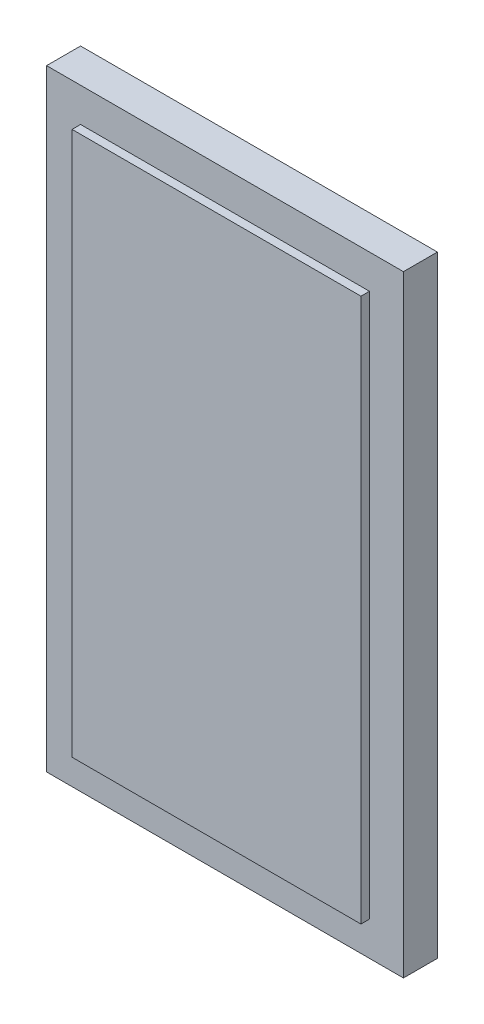
ISO-10303-21;
HEADER;
FILE_DESCRIPTION(('STEP AP214'),'2;1');
FILE_NAME('part.step','',(''),(''),'','','');
FILE_SCHEMA(('AUTOMOTIVE_DESIGN { 1 0 10303 214 1 1 1 1 }'));
ENDSEC;
DATA;
#1=APPLICATION_CONTEXT('core data for automotive mechanical design processes');
#2=APPLICATION_PROTOCOL_DEFINITION('international standard','automotive_design',2000,#1);
#3=PRODUCT_CONTEXT('',#1,'mechanical');
#4=PRODUCT('Part','Part','',(#3));
#5=PRODUCT_RELATED_PRODUCT_CATEGORY('part','',(#4));
#6=PRODUCT_DEFINITION_FORMATION('','',#4);
#7=PRODUCT_DEFINITION_CONTEXT('part definition',#1,'design');
#8=PRODUCT_DEFINITION('design','',#6,#7);
#9=PRODUCT_DEFINITION_SHAPE('','',#8);
#10=(LENGTH_UNIT() NAMED_UNIT(*) SI_UNIT(.MILLI.,.METRE.));
#11=(NAMED_UNIT(*) PLANE_ANGLE_UNIT() SI_UNIT($,.RADIAN.));
#12=(NAMED_UNIT(*) SI_UNIT($,.STERADIAN.) SOLID_ANGLE_UNIT());
#13=UNCERTAINTY_MEASURE_WITH_UNIT(LENGTH_MEASURE(1.E-05),#10,'distance_accuracy_value','');
#14=(GEOMETRIC_REPRESENTATION_CONTEXT(3) GLOBAL_UNCERTAINTY_ASSIGNED_CONTEXT((#13)) GLOBAL_UNIT_ASSIGNED_CONTEXT((#10,
#11,#12)) REPRESENTATION_CONTEXT('',''));
#15=CARTESIAN_POINT('',(0.,0.,0.));
#16=DIRECTION('',(0.,0.,1.));
#17=DIRECTION('',(1.,0.,0.));
#18=AXIS2_PLACEMENT_3D('',#15,#16,#17);
#19=CARTESIAN_POINT('',(0.,0.,10.));
#20=DIRECTION('',(0.,0.,-1.));
#21=DIRECTION('',(-1.,0.,0.));
#22=AXIS2_PLACEMENT_3D('',#19,#20,#21);
#23=PLANE('',#22);
#24=DIRECTION('',(0.,-1.,0.));
#25=VECTOR('',#24,1.);
#26=CARTESIAN_POINT('',(0.,0.,10.));
#27=LINE('',#26,#25);
#28=CARTESIAN_POINT('',(0.,180.,10.));
#29=VERTEX_POINT('',#28);
#30=CARTESIAN_POINT('',(0.,0.,10.));
#31=VERTEX_POINT('',#30);
#32=EDGE_CURVE('E133',#29,#31,#27,.T.);
#33=ORIENTED_EDGE('',*,*,#32,.T.);
#34=DIRECTION('',(1.,0.,0.));
#35=VECTOR('',#34,1.);
#36=CARTESIAN_POINT('',(0.,0.,10.));
#37=LINE('',#36,#35);
#38=CARTESIAN_POINT('',(105.,0.,10.));
#39=VERTEX_POINT('',#38);
#40=EDGE_CURVE('E136',#31,#39,#37,.T.);
#41=ORIENTED_EDGE('',*,*,#40,.T.);
#42=DIRECTION('',(0.,1.,0.));
#43=VECTOR('',#42,1.);
#44=CARTESIAN_POINT('',(105.,0.,10.));
#45=LINE('',#44,#43);
#46=CARTESIAN_POINT('',(105.,180.,10.));
#47=VERTEX_POINT('',#46);
#48=EDGE_CURVE('E139',#39,#47,#45,.T.);
#49=ORIENTED_EDGE('',*,*,#48,.T.);
#50=DIRECTION('',(-1.,0.,0.));
#51=VECTOR('',#50,1.);
#52=CARTESIAN_POINT('',(0.,180.,10.));
#53=LINE('',#52,#51);
#54=EDGE_CURVE('E141',#47,#29,#53,.T.);
#55=ORIENTED_EDGE('',*,*,#54,.T.);
#56=EDGE_LOOP('',(#33,#41,#49,#55));
#57=FACE_BOUND('',#56,.T.);
#58=DIRECTION('',(-1.,0.,0.));
#59=VECTOR('',#58,1.);
#60=CARTESIAN_POINT('',(95.,170.,10.));
#61=LINE('',#60,#59);
#62=CARTESIAN_POINT('',(95.,170.,10.));
#63=VERTEX_POINT('',#62);
#64=CARTESIAN_POINT('',(10.,170.,10.));
#65=VERTEX_POINT('',#64);
#66=EDGE_CURVE('E54',#63,#65,#61,.T.);
#67=ORIENTED_EDGE('',*,*,#66,.F.);
#68=DIRECTION('',(0.,1.,0.));
#69=VECTOR('',#68,1.);
#70=CARTESIAN_POINT('',(95.,10.,10.));
#71=LINE('',#70,#69);
#72=CARTESIAN_POINT('',(95.,10.,10.));
#73=VERTEX_POINT('',#72);
#74=EDGE_CURVE('E58',#73,#63,#71,.T.);
#75=ORIENTED_EDGE('',*,*,#74,.F.);
#76=DIRECTION('',(1.,0.,0.));
#77=VECTOR('',#76,1.);
#78=CARTESIAN_POINT('',(10.,10.,10.));
#79=LINE('',#78,#77);
#80=CARTESIAN_POINT('',(10.,10.,10.));
#81=VERTEX_POINT('',#80);
#82=EDGE_CURVE('E251',#81,#73,#79,.T.);
#83=ORIENTED_EDGE('',*,*,#82,.F.);
#84=DIRECTION('',(0.,-1.,0.));
#85=VECTOR('',#84,1.);
#86=CARTESIAN_POINT('',(10.,170.,10.));
#87=LINE('',#86,#85);
#88=EDGE_CURVE('E257',#65,#81,#87,.T.);
#89=ORIENTED_EDGE('',*,*,#88,.F.);
#90=EDGE_LOOP('',(#67,#75,#83,#89));
#91=FACE_BOUND('',#90,.T.);
#92=ADVANCED_FACE('F39',(#57,#91),#23,.F.);
#93=CARTESIAN_POINT('',(0.,0.,10.));
#94=DIRECTION('',(1.,0.,0.));
#95=DIRECTION('',(0.,0.,-1.));
#96=AXIS2_PLACEMENT_3D('',#93,#94,#95);
#97=PLANE('',#96);
#98=DIRECTION('',(0.,-1.,0.));
#99=VECTOR('',#98,1.);
#100=CARTESIAN_POINT('',(0.,0.,0.));
#101=LINE('',#100,#99);
#102=CARTESIAN_POINT('',(0.,180.,0.));
#103=VERTEX_POINT('',#102);
#104=CARTESIAN_POINT('',(0.,0.,0.));
#105=VERTEX_POINT('',#104);
#106=EDGE_CURVE('E124',#103,#105,#101,.T.);
#107=ORIENTED_EDGE('',*,*,#106,.T.);
#108=DIRECTION('',(0.,0.,-1.));
#109=VECTOR('',#108,1.);
#110=CARTESIAN_POINT('',(0.,0.,10.));
#111=LINE('',#110,#109);
#112=EDGE_CURVE('E11',#31,#105,#111,.T.);
#113=ORIENTED_EDGE('',*,*,#112,.F.);
#114=ORIENTED_EDGE('',*,*,#32,.F.);
#115=DIRECTION('',(0.,0.,-1.));
#116=VECTOR('',#115,1.);
#117=CARTESIAN_POINT('',(0.,180.,10.));
#118=LINE('',#117,#116);
#119=EDGE_CURVE('E142',#29,#103,#118,.T.);
#120=ORIENTED_EDGE('',*,*,#119,.T.);
#121=EDGE_LOOP('',(#107,#113,#114,#120));
#122=FACE_BOUND('',#121,.T.);
#123=ADVANCED_FACE('F41',(#122),#97,.F.);
#124=CARTESIAN_POINT('',(0.,0.,10.));
#125=DIRECTION('',(0.,1.,0.));
#126=DIRECTION('',(0.,0.,1.));
#127=AXIS2_PLACEMENT_3D('',#124,#125,#126);
#128=PLANE('',#127);
#129=DIRECTION('',(1.,0.,0.));
#130=VECTOR('',#129,1.);
#131=CARTESIAN_POINT('',(0.,0.,0.));
#132=LINE('',#131,#130);
#133=CARTESIAN_POINT('',(105.,0.,0.));
#134=VERTEX_POINT('',#133);
#135=EDGE_CURVE('E127',#105,#134,#132,.T.);
#136=ORIENTED_EDGE('',*,*,#135,.T.);
#137=DIRECTION('',(0.,0.,-1.));
#138=VECTOR('',#137,1.);
#139=CARTESIAN_POINT('',(105.,0.,10.));
#140=LINE('',#139,#138);
#141=EDGE_CURVE('E47',#39,#134,#140,.T.);
#142=ORIENTED_EDGE('',*,*,#141,.F.);
#143=ORIENTED_EDGE('',*,*,#40,.F.);
#144=ORIENTED_EDGE('',*,*,#112,.T.);
#145=EDGE_LOOP('',(#136,#142,#143,#144));
#146=FACE_BOUND('',#145,.T.);
#147=ADVANCED_FACE('F172',(#146),#128,.F.);
#148=CARTESIAN_POINT('',(105.,0.,10.));
#149=DIRECTION('',(-1.,0.,0.));
#150=DIRECTION('',(0.,0.,1.));
#151=AXIS2_PLACEMENT_3D('',#148,#149,#150);
#152=PLANE('',#151);
#153=DIRECTION('',(0.,1.,0.));
#154=VECTOR('',#153,1.);
#155=CARTESIAN_POINT('',(105.,0.,0.));
#156=LINE('',#155,#154);
#157=CARTESIAN_POINT('',(105.,180.,0.));
#158=VERTEX_POINT('',#157);
#159=EDGE_CURVE('E145',#134,#158,#156,.T.);
#160=ORIENTED_EDGE('',*,*,#159,.T.);
#161=DIRECTION('',(0.,0.,-1.));
#162=VECTOR('',#161,1.);
#163=CARTESIAN_POINT('',(105.,180.,10.));
#164=LINE('',#163,#162);
#165=EDGE_CURVE('E150',#47,#158,#164,.T.);
#166=ORIENTED_EDGE('',*,*,#165,.F.);
#167=ORIENTED_EDGE('',*,*,#48,.F.);
#168=ORIENTED_EDGE('',*,*,#141,.T.);
#169=EDGE_LOOP('',(#160,#166,#167,#168));
#170=FACE_BOUND('',#169,.T.);
#171=ADVANCED_FACE('F157',(#170),#152,.F.);
#172=CARTESIAN_POINT('',(0.,180.,10.));
#173=DIRECTION('',(0.,-1.,0.));
#174=DIRECTION('',(0.,0.,-1.));
#175=AXIS2_PLACEMENT_3D('',#172,#173,#174);
#176=PLANE('',#175);
#177=DIRECTION('',(-1.,0.,0.));
#178=VECTOR('',#177,1.);
#179=CARTESIAN_POINT('',(0.,180.,0.));
#180=LINE('',#179,#178);
#181=EDGE_CURVE('E137',#158,#103,#180,.T.);
#182=ORIENTED_EDGE('',*,*,#181,.T.);
#183=ORIENTED_EDGE('',*,*,#119,.F.);
#184=ORIENTED_EDGE('',*,*,#54,.F.);
#185=ORIENTED_EDGE('',*,*,#165,.T.);
#186=EDGE_LOOP('',(#182,#183,#184,#185));
#187=FACE_BOUND('',#186,.T.);
#188=ADVANCED_FACE('F166',(#187),#176,.F.);
#189=CARTESIAN_POINT('',(0.,0.,0.));
#190=DIRECTION('',(0.,0.,-1.));
#191=DIRECTION('',(-1.,0.,0.));
#192=AXIS2_PLACEMENT_3D('',#189,#190,#191);
#193=PLANE('',#192);
#194=ORIENTED_EDGE('',*,*,#106,.F.);
#195=ORIENTED_EDGE('',*,*,#181,.F.);
#196=ORIENTED_EDGE('',*,*,#159,.F.);
#197=ORIENTED_EDGE('',*,*,#135,.F.);
#198=EDGE_LOOP('',(#194,#195,#196,#197));
#199=FACE_BOUND('',#198,.T.);
#200=ADVANCED_FACE('F163',(#199),#193,.T.);
#201=CARTESIAN_POINT('',(95.,170.,12.5));
#202=DIRECTION('',(0.,-1.,0.));
#203=DIRECTION('',(0.,0.,-1.));
#204=AXIS2_PLACEMENT_3D('',#201,#202,#203);
#205=PLANE('',#204);
#206=ORIENTED_EDGE('',*,*,#66,.T.);
#207=DIRECTION('',(0.,0.,-1.));
#208=VECTOR('',#207,1.);
#209=CARTESIAN_POINT('',(10.,170.,12.5));
#210=LINE('',#209,#208);
#211=CARTESIAN_POINT('',(10.,170.,12.5));
#212=VERTEX_POINT('',#211);
#213=EDGE_CURVE('E107',#212,#65,#210,.T.);
#214=ORIENTED_EDGE('',*,*,#213,.F.);
#215=DIRECTION('',(-1.,0.,0.));
#216=VECTOR('',#215,1.);
#217=CARTESIAN_POINT('',(95.,170.,12.5));
#218=LINE('',#217,#216);
#219=CARTESIAN_POINT('',(95.,170.,12.5));
#220=VERTEX_POINT('',#219);
#221=EDGE_CURVE('E113',#220,#212,#218,.T.);
#222=ORIENTED_EDGE('',*,*,#221,.F.);
#223=DIRECTION('',(0.,0.,-1.));
#224=VECTOR('',#223,1.);
#225=CARTESIAN_POINT('',(95.,170.,12.5));
#226=LINE('',#225,#224);
#227=EDGE_CURVE('E249',#220,#63,#226,.T.);
#228=ORIENTED_EDGE('',*,*,#227,.T.);
#229=EDGE_LOOP('',(#206,#214,#222,#228));
#230=FACE_BOUND('',#229,.T.);
#231=ADVANCED_FACE('F123',(#230),#205,.F.);
#232=CARTESIAN_POINT('',(10.,170.,12.5));
#233=DIRECTION('',(1.,0.,0.));
#234=DIRECTION('',(0.,0.,-1.));
#235=AXIS2_PLACEMENT_3D('',#232,#233,#234);
#236=PLANE('',#235);
#237=ORIENTED_EDGE('',*,*,#88,.T.);
#238=DIRECTION('',(0.,0.,-1.));
#239=VECTOR('',#238,1.);
#240=CARTESIAN_POINT('',(10.,10.,12.5));
#241=LINE('',#240,#239);
#242=CARTESIAN_POINT('',(10.,10.,12.5));
#243=VERTEX_POINT('',#242);
#244=EDGE_CURVE('E109',#243,#81,#241,.T.);
#245=ORIENTED_EDGE('',*,*,#244,.F.);
#246=DIRECTION('',(0.,-1.,0.));
#247=VECTOR('',#246,1.);
#248=CARTESIAN_POINT('',(10.,170.,12.5));
#249=LINE('',#248,#247);
#250=EDGE_CURVE('E102',#212,#243,#249,.T.);
#251=ORIENTED_EDGE('',*,*,#250,.F.);
#252=ORIENTED_EDGE('',*,*,#213,.T.);
#253=EDGE_LOOP('',(#237,#245,#251,#252));
#254=FACE_BOUND('',#253,.T.);
#255=ADVANCED_FACE('F105',(#254),#236,.F.);
#256=CARTESIAN_POINT('',(10.,10.,12.5));
#257=DIRECTION('',(0.,1.,0.));
#258=DIRECTION('',(0.,0.,1.));
#259=AXIS2_PLACEMENT_3D('',#256,#257,#258);
#260=PLANE('',#259);
#261=ORIENTED_EDGE('',*,*,#82,.T.);
#262=DIRECTION('',(0.,0.,-1.));
#263=VECTOR('',#262,1.);
#264=CARTESIAN_POINT('',(95.,10.,12.5));
#265=LINE('',#264,#263);
#266=CARTESIAN_POINT('',(95.,10.,12.5));
#267=VERTEX_POINT('',#266);
#268=EDGE_CURVE('E129',#267,#73,#265,.T.);
#269=ORIENTED_EDGE('',*,*,#268,.F.);
#270=DIRECTION('',(1.,0.,0.));
#271=VECTOR('',#270,1.);
#272=CARTESIAN_POINT('',(10.,10.,12.5));
#273=LINE('',#272,#271);
#274=EDGE_CURVE('E112',#243,#267,#273,.T.);
#275=ORIENTED_EDGE('',*,*,#274,.F.);
#276=ORIENTED_EDGE('',*,*,#244,.T.);
#277=EDGE_LOOP('',(#261,#269,#275,#276));
#278=FACE_BOUND('',#277,.T.);
#279=ADVANCED_FACE('F219',(#278),#260,.F.);
#280=CARTESIAN_POINT('',(95.,10.,12.5));
#281=DIRECTION('',(-1.,0.,0.));
#282=DIRECTION('',(0.,0.,1.));
#283=AXIS2_PLACEMENT_3D('',#280,#281,#282);
#284=PLANE('',#283);
#285=ORIENTED_EDGE('',*,*,#74,.T.);
#286=ORIENTED_EDGE('',*,*,#227,.F.);
#287=DIRECTION('',(0.,1.,0.));
#288=VECTOR('',#287,1.);
#289=CARTESIAN_POINT('',(95.,10.,12.5));
#290=LINE('',#289,#288);
#291=EDGE_CURVE('E118',#267,#220,#290,.T.);
#292=ORIENTED_EDGE('',*,*,#291,.F.);
#293=ORIENTED_EDGE('',*,*,#268,.T.);
#294=EDGE_LOOP('',(#285,#286,#292,#293));
#295=FACE_BOUND('',#294,.T.);
#296=ADVANCED_FACE('F227',(#295),#284,.F.);
#297=CARTESIAN_POINT('',(0.,0.,12.5));
#298=DIRECTION('',(0.,0.,1.));
#299=DIRECTION('',(1.,0.,0.));
#300=AXIS2_PLACEMENT_3D('',#297,#298,#299);
#301=PLANE('',#300);
#302=ORIENTED_EDGE('',*,*,#221,.T.);
#303=ORIENTED_EDGE('',*,*,#250,.T.);
#304=ORIENTED_EDGE('',*,*,#274,.T.);
#305=ORIENTED_EDGE('',*,*,#291,.T.);
#306=EDGE_LOOP('',(#302,#303,#304,#305));
#307=FACE_BOUND('',#306,.T.);
#308=ADVANCED_FACE('F116',(#307),#301,.T.);
#309=CLOSED_SHELL('',(#92,#123,#147,#171,#188,#200,#231,#255,#279,#296,#308));
#310=MANIFOLD_SOLID_BREP('B2',#309);
#311=ADVANCED_BREP_SHAPE_REPRESENTATION('',(#18,#310),#14);
#312=SHAPE_DEFINITION_REPRESENTATION(#9,#311);
ENDSEC;
END-ISO-10303-21;
